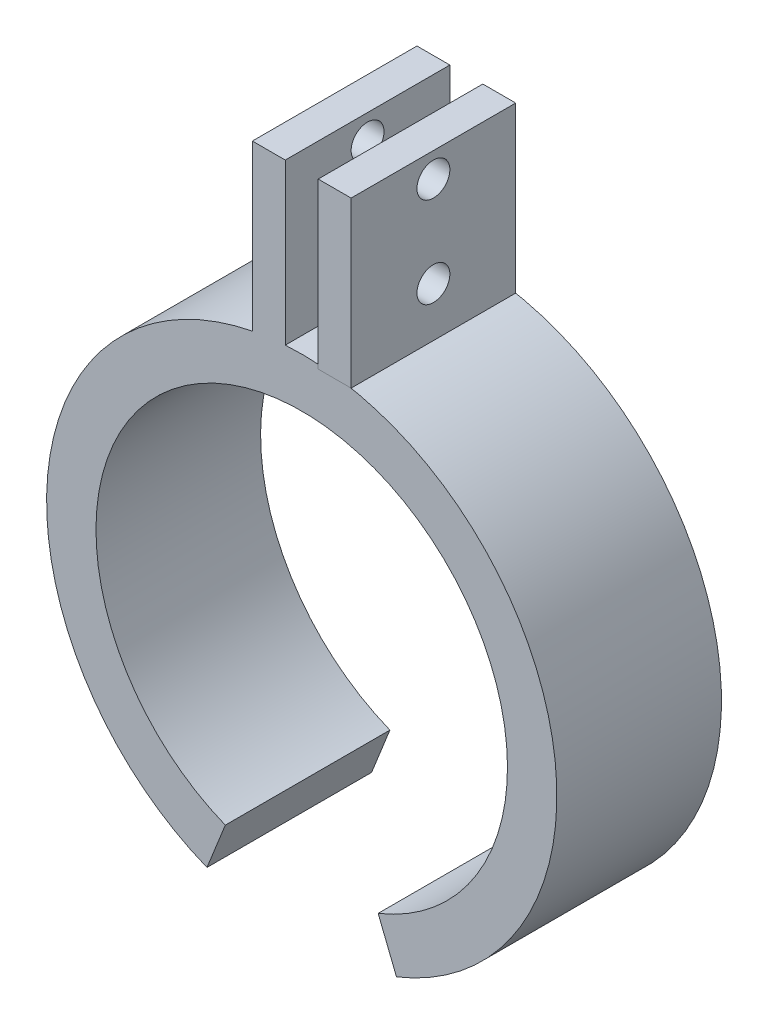
ISO-10303-21;
HEADER;
FILE_DESCRIPTION(('STEP AP214'),'2;1');
FILE_NAME('part.step','',(''),(''),'','','');
FILE_SCHEMA(('AUTOMOTIVE_DESIGN { 1 0 10303 214 1 1 1 1 }'));
ENDSEC;
DATA;
#1=APPLICATION_CONTEXT('core data for automotive mechanical design processes');
#2=APPLICATION_PROTOCOL_DEFINITION('international standard','automotive_design',2000,#1);
#3=PRODUCT_CONTEXT('',#1,'mechanical');
#4=PRODUCT('Part','Part','',(#3));
#5=PRODUCT_RELATED_PRODUCT_CATEGORY('part','',(#4));
#6=PRODUCT_DEFINITION_FORMATION('','',#4);
#7=PRODUCT_DEFINITION_CONTEXT('part definition',#1,'design');
#8=PRODUCT_DEFINITION('design','',#6,#7);
#9=PRODUCT_DEFINITION_SHAPE('','',#8);
#10=(LENGTH_UNIT() NAMED_UNIT(*) SI_UNIT(.MILLI.,.METRE.));
#11=(NAMED_UNIT(*) PLANE_ANGLE_UNIT() SI_UNIT($,.RADIAN.));
#12=(NAMED_UNIT(*) SI_UNIT($,.STERADIAN.) SOLID_ANGLE_UNIT());
#13=UNCERTAINTY_MEASURE_WITH_UNIT(LENGTH_MEASURE(1.E-05),#10,'distance_accuracy_value','');
#14=(GEOMETRIC_REPRESENTATION_CONTEXT(3) GLOBAL_UNCERTAINTY_ASSIGNED_CONTEXT((#13)) GLOBAL_UNIT_ASSIGNED_CONTEXT((#10,
#11,#12)) REPRESENTATION_CONTEXT('',''));
#15=CARTESIAN_POINT('',(0.,0.,0.));
#16=DIRECTION('',(0.,0.,1.));
#17=DIRECTION('',(1.,0.,0.));
#18=AXIS2_PLACEMENT_3D('',#15,#16,#17);
#19=CARTESIAN_POINT('',(3.,15.2069063257455,10.));
#20=DIRECTION('',(-1.,0.,0.));
#21=DIRECTION('',(0.,0.,1.));
#22=AXIS2_PLACEMENT_3D('',#19,#20,#21);
#23=PLANE('',#22);
#24=CARTESIAN_POINT('',(3.,23.7069063257455,5.));
#25=DIRECTION('',(-1.,0.,0.));
#26=DIRECTION('',(0.,0.,1.));
#27=AXIS2_PLACEMENT_3D('',#24,#25,#26);
#28=CIRCLE('',#27,1.);
#29=CARTESIAN_POINT('',(3.,23.7069063257455,6.));
#30=VERTEX_POINT('',#29);
#31=EDGE_CURVE('E117',#30,#30,#28,.T.);
#32=ORIENTED_EDGE('',*,*,#31,.T.);
#33=EDGE_LOOP('',(#32));
#34=FACE_BOUND('',#33,.T.);
#35=CARTESIAN_POINT('',(3.,18.2069063257455,5.));
#36=DIRECTION('',(-1.,0.,0.));
#37=DIRECTION('',(0.,0.,1.));
#38=AXIS2_PLACEMENT_3D('',#35,#36,#37);
#39=CIRCLE('',#38,1.);
#40=CARTESIAN_POINT('',(3.,18.2069063257455,6.));
#41=VERTEX_POINT('',#40);
#42=EDGE_CURVE('E127',#41,#41,#39,.T.);
#43=ORIENTED_EDGE('',*,*,#42,.T.);
#44=EDGE_LOOP('',(#43));
#45=FACE_BOUND('',#44,.T.);
#46=DIRECTION('',(0.,1.,0.));
#47=VECTOR('',#46,1.);
#48=CARTESIAN_POINT('',(3.,15.2069063257455,0.));
#49=LINE('',#48,#47);
#50=CARTESIAN_POINT('',(3.,15.2069063257455,0.));
#51=VERTEX_POINT('',#50);
#52=CARTESIAN_POINT('',(3.,25.2069063257455,0.));
#53=VERTEX_POINT('',#52);
#54=EDGE_CURVE('E115',#51,#53,#49,.T.);
#55=ORIENTED_EDGE('',*,*,#54,.T.);
#56=DIRECTION('',(0.,0.,-1.));
#57=VECTOR('',#56,1.);
#58=CARTESIAN_POINT('',(3.,25.2069063257455,10.));
#59=LINE('',#58,#57);
#60=CARTESIAN_POINT('',(3.,25.2069063257455,10.));
#61=VERTEX_POINT('',#60);
#62=EDGE_CURVE('E12',#61,#53,#59,.T.);
#63=ORIENTED_EDGE('',*,*,#62,.F.);
#64=DIRECTION('',(0.,1.,0.));
#65=VECTOR('',#64,1.);
#66=CARTESIAN_POINT('',(3.,15.2069063257455,10.));
#67=LINE('',#66,#65);
#68=CARTESIAN_POINT('',(3.,15.2069063257455,10.));
#69=VERTEX_POINT('',#68);
#70=EDGE_CURVE('E91',#69,#61,#67,.T.);
#71=ORIENTED_EDGE('',*,*,#70,.F.);
#72=DIRECTION('',(0.,0.,-1.));
#73=VECTOR('',#72,1.);
#74=CARTESIAN_POINT('',(3.,15.2069063257455,10.));
#75=LINE('',#74,#73);
#76=EDGE_CURVE('E67',#69,#51,#75,.T.);
#77=ORIENTED_EDGE('',*,*,#76,.T.);
#78=EDGE_LOOP('',(#55,#63,#71,#77));
#79=FACE_BOUND('',#78,.T.);
#80=ADVANCED_FACE('F49',(#34,#45,#79),#23,.F.);
#81=CARTESIAN_POINT('',(1.,25.2069063257455,10.));
#82=DIRECTION('',(0.,1.,0.));
#83=DIRECTION('',(0.,0.,1.));
#84=AXIS2_PLACEMENT_3D('',#81,#82,#83);
#85=PLANE('',#84);
#86=DIRECTION('',(1.,0.,0.));
#87=VECTOR('',#86,1.);
#88=CARTESIAN_POINT('',(1.,25.2069063257455,0.));
#89=LINE('',#88,#87);
#90=CARTESIAN_POINT('',(1.,25.2069063257455,0.));
#91=VERTEX_POINT('',#90);
#92=EDGE_CURVE('E100',#91,#53,#89,.T.);
#93=ORIENTED_EDGE('',*,*,#92,.F.);
#94=DIRECTION('',(0.,0.,-1.));
#95=VECTOR('',#94,1.);
#96=CARTESIAN_POINT('',(1.,25.2069063257455,10.));
#97=LINE('',#96,#95);
#98=CARTESIAN_POINT('',(1.,25.2069063257455,10.));
#99=VERTEX_POINT('',#98);
#100=EDGE_CURVE('E58',#99,#91,#97,.T.);
#101=ORIENTED_EDGE('',*,*,#100,.F.);
#102=DIRECTION('',(1.,0.,0.));
#103=VECTOR('',#102,1.);
#104=CARTESIAN_POINT('',(1.,25.2069063257455,10.));
#105=LINE('',#104,#103);
#106=EDGE_CURVE('E98',#99,#61,#105,.T.);
#107=ORIENTED_EDGE('',*,*,#106,.T.);
#108=ORIENTED_EDGE('',*,*,#62,.T.);
#109=EDGE_LOOP('',(#93,#101,#107,#108));
#110=FACE_BOUND('',#109,.T.);
#111=ADVANCED_FACE('F97',(#110),#85,.T.);
#112=CARTESIAN_POINT('',(1.,15.2069063257455,10.));
#113=DIRECTION('',(-1.,0.,0.));
#114=DIRECTION('',(0.,0.,1.));
#115=AXIS2_PLACEMENT_3D('',#112,#113,#114);
#116=PLANE('',#115);
#117=CARTESIAN_POINT('',(1.,23.7069063257455,5.));
#118=DIRECTION('',(-1.,0.,0.));
#119=DIRECTION('',(0.,0.,1.));
#120=AXIS2_PLACEMENT_3D('',#117,#118,#119);
#121=CIRCLE('',#120,1.);
#122=CARTESIAN_POINT('',(1.,23.7069063257455,6.));
#123=VERTEX_POINT('',#122);
#124=EDGE_CURVE('E52',#123,#123,#121,.T.);
#125=ORIENTED_EDGE('',*,*,#124,.F.);
#126=EDGE_LOOP('',(#125));
#127=FACE_BOUND('',#126,.T.);
#128=CARTESIAN_POINT('',(1.,18.2069063257455,5.));
#129=DIRECTION('',(-1.,0.,0.));
#130=DIRECTION('',(0.,0.,1.));
#131=AXIS2_PLACEMENT_3D('',#128,#129,#130);
#132=CIRCLE('',#131,1.);
#133=CARTESIAN_POINT('',(1.,18.2069063257455,6.));
#134=VERTEX_POINT('',#133);
#135=EDGE_CURVE('E125',#134,#134,#132,.T.);
#136=ORIENTED_EDGE('',*,*,#135,.F.);
#137=EDGE_LOOP('',(#136));
#138=FACE_BOUND('',#137,.T.);
#139=DIRECTION('',(0.,1.,0.));
#140=VECTOR('',#139,1.);
#141=CARTESIAN_POINT('',(1.,15.2069063257455,0.));
#142=LINE('',#141,#140);
#143=CARTESIAN_POINT('',(1.,15.2069063257455,0.));
#144=VERTEX_POINT('',#143);
#145=EDGE_CURVE('E119',#144,#91,#142,.T.);
#146=ORIENTED_EDGE('',*,*,#145,.F.);
#147=DIRECTION('',(0.,0.,-1.));
#148=VECTOR('',#147,1.);
#149=CARTESIAN_POINT('',(1.,15.2069063257455,10.));
#150=LINE('',#149,#148);
#151=CARTESIAN_POINT('',(1.,15.2069063257455,10.));
#152=VERTEX_POINT('',#151);
#153=EDGE_CURVE('E80',#152,#144,#150,.T.);
#154=ORIENTED_EDGE('',*,*,#153,.F.);
#155=DIRECTION('',(0.,1.,0.));
#156=VECTOR('',#155,1.);
#157=CARTESIAN_POINT('',(1.,15.2069063257455,10.));
#158=LINE('',#157,#156);
#159=EDGE_CURVE('E107',#152,#99,#158,.T.);
#160=ORIENTED_EDGE('',*,*,#159,.T.);
#161=ORIENTED_EDGE('',*,*,#100,.T.);
#162=EDGE_LOOP('',(#146,#154,#160,#161));
#163=FACE_BOUND('',#162,.T.);
#164=ADVANCED_FACE('F109',(#127,#138,#163),#116,.T.);
#165=CARTESIAN_POINT('',(3.,15.2069063257455,10.));
#166=DIRECTION('',(0.,-1.,0.));
#167=DIRECTION('',(0.,0.,-1.));
#168=AXIS2_PLACEMENT_3D('',#165,#166,#167);
#169=PLANE('',#168);
#170=DIRECTION('',(-1.,0.,0.));
#171=VECTOR('',#170,1.);
#172=CARTESIAN_POINT('',(3.,15.2069063257455,0.));
#173=LINE('',#172,#171);
#174=EDGE_CURVE('E121',#51,#144,#173,.T.);
#175=ORIENTED_EDGE('',*,*,#174,.F.);
#176=ORIENTED_EDGE('',*,*,#76,.F.);
#177=DIRECTION('',(-1.,0.,0.));
#178=VECTOR('',#177,1.);
#179=CARTESIAN_POINT('',(3.,15.2069063257455,10.));
#180=LINE('',#179,#178);
#181=EDGE_CURVE('E110',#69,#152,#180,.T.);
#182=ORIENTED_EDGE('',*,*,#181,.T.);
#183=ORIENTED_EDGE('',*,*,#153,.T.);
#184=EDGE_LOOP('',(#175,#176,#182,#183));
#185=FACE_BOUND('',#184,.T.);
#186=ADVANCED_FACE('F157',(#185),#169,.T.);
#187=CARTESIAN_POINT('',(0.,0.,10.));
#188=DIRECTION('',(0.,0.,-1.));
#189=DIRECTION('',(-1.,0.,0.));
#190=AXIS2_PLACEMENT_3D('',#187,#188,#189);
#191=PLANE('',#190);
#192=ORIENTED_EDGE('',*,*,#70,.T.);
#193=ORIENTED_EDGE('',*,*,#106,.F.);
#194=ORIENTED_EDGE('',*,*,#159,.F.);
#195=ORIENTED_EDGE('',*,*,#181,.F.);
#196=EDGE_LOOP('',(#192,#193,#194,#195));
#197=FACE_BOUND('',#196,.T.);
#198=ADVANCED_FACE('F106',(#197),#191,.F.);
#199=CARTESIAN_POINT('',(0.,0.,0.));
#200=DIRECTION('',(0.,0.,-1.));
#201=DIRECTION('',(-1.,0.,0.));
#202=AXIS2_PLACEMENT_3D('',#199,#200,#201);
#203=PLANE('',#202);
#204=ORIENTED_EDGE('',*,*,#54,.F.);
#205=ORIENTED_EDGE('',*,*,#174,.T.);
#206=ORIENTED_EDGE('',*,*,#145,.T.);
#207=ORIENTED_EDGE('',*,*,#92,.T.);
#208=EDGE_LOOP('',(#204,#205,#206,#207));
#209=FACE_BOUND('',#208,.T.);
#210=ADVANCED_FACE('F148',(#209),#203,.T.);
#211=CARTESIAN_POINT('',(15.5,18.2069063257455,5.));
#212=DIRECTION('',(-1.,0.,0.));
#213=DIRECTION('',(0.,0.,1.));
#214=AXIS2_PLACEMENT_3D('',#211,#212,#213);
#215=CYLINDRICAL_SURFACE('',#214,1.);
#216=ORIENTED_EDGE('',*,*,#135,.T.);
#217=EDGE_LOOP('',(#216));
#218=FACE_BOUND('',#217,.T.);
#219=ORIENTED_EDGE('',*,*,#42,.F.);
#220=EDGE_LOOP('',(#219));
#221=FACE_BOUND('',#220,.T.);
#222=ADVANCED_FACE('F142',(#218,#221),#215,.F.);
#223=CARTESIAN_POINT('',(15.5,23.7069063257455,5.));
#224=DIRECTION('',(-1.,0.,0.));
#225=DIRECTION('',(0.,0.,1.));
#226=AXIS2_PLACEMENT_3D('',#223,#224,#225);
#227=CYLINDRICAL_SURFACE('',#226,1.);
#228=ORIENTED_EDGE('',*,*,#124,.T.);
#229=EDGE_LOOP('',(#228));
#230=FACE_BOUND('',#229,.T.);
#231=ORIENTED_EDGE('',*,*,#31,.F.);
#232=EDGE_LOOP('',(#231));
#233=FACE_BOUND('',#232,.T.);
#234=ADVANCED_FACE('F140',(#230,#233),#227,.F.);
#235=CLOSED_SHELL('',(#80,#111,#164,#186,#198,#210,#222,#234));
#236=MANIFOLD_SOLID_BREP('B2',#235);
#237=CARTESIAN_POINT('',(0.,0.,10.));
#238=DIRECTION('',(0.,0.,-1.));
#239=DIRECTION('',(-1.,0.,0.));
#240=AXIS2_PLACEMENT_3D('',#237,#238,#239);
#241=CYLINDRICAL_SURFACE('',#240,15.5);
#242=DIRECTION('',(0.,0.,1.));
#243=VECTOR('',#242,1.);
#244=CARTESIAN_POINT('',(-3.,15.2069063257455,0.));
#245=LINE('',#244,#243);
#246=CARTESIAN_POINT('',(-3.,15.2069063257455,0.));
#247=VERTEX_POINT('',#246);
#248=CARTESIAN_POINT('',(-3.,15.2069063257455,10.));
#249=VERTEX_POINT('',#248);
#250=EDGE_CURVE('E319',#247,#249,#245,.T.);
#251=ORIENTED_EDGE('',*,*,#250,.F.);
#252=CARTESIAN_POINT('',(0.,0.,0.));
#253=DIRECTION('',(0.,0.,1.));
#254=DIRECTION('',(1.,0.,0.));
#255=AXIS2_PLACEMENT_3D('',#252,#253,#254);
#256=CIRCLE('',#255,15.5);
#257=CARTESIAN_POINT('',(-5.75655548348861,-14.3913887087215,0.));
#258=VERTEX_POINT('',#257);
#259=EDGE_CURVE('E326',#247,#258,#256,.T.);
#260=ORIENTED_EDGE('',*,*,#259,.T.);
#261=DIRECTION('',(0.,0.,-1.));
#262=VECTOR('',#261,1.);
#263=CARTESIAN_POINT('',(-5.75655548348861,-14.3913887087215,10.));
#264=LINE('',#263,#262);
#265=CARTESIAN_POINT('',(-5.75655548348861,-14.3913887087215,10.));
#266=VERTEX_POINT('',#265);
#267=EDGE_CURVE('E47',#266,#258,#264,.T.);
#268=ORIENTED_EDGE('',*,*,#267,.F.);
#269=CARTESIAN_POINT('',(0.,0.,10.));
#270=DIRECTION('',(0.,0.,1.));
#271=DIRECTION('',(1.,0.,0.));
#272=AXIS2_PLACEMENT_3D('',#269,#270,#271);
#273=CIRCLE('',#272,15.5);
#274=EDGE_CURVE('E266',#249,#266,#273,.T.);
#275=ORIENTED_EDGE('',*,*,#274,.F.);
#276=EDGE_LOOP('',(#251,#260,#268,#275));
#277=FACE_BOUND('',#276,.T.);
#278=ADVANCED_FACE('F215',(#277),#241,.T.);
#279=CARTESIAN_POINT('',(5.75655548348861,-14.3913887087215,0.));
#280=VERTEX_POINT('',#279);
#281=CARTESIAN_POINT('',(-1.,15.467708298258,0.));
#282=VERTEX_POINT('',#281);
#283=EDGE_CURVE('E342',#280,#282,#256,.T.);
#284=ORIENTED_EDGE('',*,*,#283,.T.);
#285=DIRECTION('',(0.,0.,-1.));
#286=VECTOR('',#285,1.);
#287=CARTESIAN_POINT('',(-1.,15.467708298258,10.));
#288=LINE('',#287,#286);
#289=CARTESIAN_POINT('',(-1.,15.467708298258,10.));
#290=VERTEX_POINT('',#289);
#291=EDGE_CURVE('E298',#282,#290,#288,.F.);
#292=ORIENTED_EDGE('',*,*,#291,.T.);
#293=CARTESIAN_POINT('',(5.75655548348861,-14.3913887087215,10.));
#294=VERTEX_POINT('',#293);
#295=EDGE_CURVE('E327',#294,#290,#273,.T.);
#296=ORIENTED_EDGE('',*,*,#295,.F.);
#297=DIRECTION('',(0.,0.,-1.));
#298=VECTOR('',#297,1.);
#299=CARTESIAN_POINT('',(5.75655548348861,-14.3913887087215,10.));
#300=LINE('',#299,#298);
#301=EDGE_CURVE('E242',#294,#280,#300,.T.);
#302=ORIENTED_EDGE('',*,*,#301,.T.);
#303=EDGE_LOOP('',(#284,#292,#296,#302));
#304=FACE_BOUND('',#303,.T.);
#305=ADVANCED_FACE('F217',(#304),#241,.T.);
#306=CARTESIAN_POINT('',(-4.6423834544263,-11.6059586360657,10.));
#307=DIRECTION('',(0.928476690885259,-0.371390676354104,0.));
#308=DIRECTION('',(0.371390676354104,0.928476690885259,0.));
#309=AXIS2_PLACEMENT_3D('',#306,#307,#308);
#310=PLANE('',#309);
#311=DIRECTION('',(-0.371390676354104,-0.928476690885259,0.));
#312=VECTOR('',#311,1.);
#313=CARTESIAN_POINT('',(-4.6423834544263,-11.6059586360657,0.));
#314=LINE('',#313,#312);
#315=CARTESIAN_POINT('',(-4.6423834544263,-11.6059586360657,0.));
#316=VERTEX_POINT('',#315);
#317=EDGE_CURVE('E345',#316,#258,#314,.T.);
#318=ORIENTED_EDGE('',*,*,#317,.F.);
#319=DIRECTION('',(0.,0.,-1.));
#320=VECTOR('',#319,1.);
#321=CARTESIAN_POINT('',(-4.6423834544263,-11.6059586360657,10.));
#322=LINE('',#321,#320);
#323=CARTESIAN_POINT('',(-4.6423834544263,-11.6059586360657,10.));
#324=VERTEX_POINT('',#323);
#325=EDGE_CURVE('E225',#324,#316,#322,.T.);
#326=ORIENTED_EDGE('',*,*,#325,.F.);
#327=DIRECTION('',(-0.371390676354104,-0.928476690885259,0.));
#328=VECTOR('',#327,1.);
#329=CARTESIAN_POINT('',(-4.6423834544263,-11.6059586360657,10.));
#330=LINE('',#329,#328);
#331=EDGE_CURVE('E331',#324,#266,#330,.T.);
#332=ORIENTED_EDGE('',*,*,#331,.T.);
#333=ORIENTED_EDGE('',*,*,#267,.T.);
#334=EDGE_LOOP('',(#318,#326,#332,#333));
#335=FACE_BOUND('',#334,.T.);
#336=ADVANCED_FACE('F396',(#335),#310,.T.);
#337=CARTESIAN_POINT('',(0.,0.,10.));
#338=DIRECTION('',(0.,0.,-1.));
#339=DIRECTION('',(-1.,0.,0.));
#340=AXIS2_PLACEMENT_3D('',#337,#338,#339);
#341=CYLINDRICAL_SURFACE('',#340,12.5);
#342=CARTESIAN_POINT('',(0.,0.,0.));
#343=DIRECTION('',(0.,0.,1.));
#344=DIRECTION('',(1.,0.,0.));
#345=AXIS2_PLACEMENT_3D('',#342,#343,#344);
#346=CIRCLE('',#345,12.5);
#347=CARTESIAN_POINT('',(4.64238345442629,-11.6059586360657,0.));
#348=VERTEX_POINT('',#347);
#349=EDGE_CURVE('E349',#348,#316,#346,.T.);
#350=ORIENTED_EDGE('',*,*,#349,.F.);
#351=DIRECTION('',(0.,0.,-1.));
#352=VECTOR('',#351,1.);
#353=CARTESIAN_POINT('',(4.64238345442629,-11.6059586360657,10.));
#354=LINE('',#353,#352);
#355=CARTESIAN_POINT('',(4.64238345442629,-11.6059586360657,10.));
#356=VERTEX_POINT('',#355);
#357=EDGE_CURVE('E359',#356,#348,#354,.T.);
#358=ORIENTED_EDGE('',*,*,#357,.F.);
#359=CARTESIAN_POINT('',(0.,0.,10.));
#360=DIRECTION('',(0.,0.,1.));
#361=DIRECTION('',(1.,0.,0.));
#362=AXIS2_PLACEMENT_3D('',#359,#360,#361);
#363=CIRCLE('',#362,12.5);
#364=EDGE_CURVE('E335',#356,#324,#363,.T.);
#365=ORIENTED_EDGE('',*,*,#364,.T.);
#366=ORIENTED_EDGE('',*,*,#325,.T.);
#367=EDGE_LOOP('',(#350,#358,#365,#366));
#368=FACE_BOUND('',#367,.T.);
#369=ADVANCED_FACE('F399',(#368),#341,.F.);
#370=CARTESIAN_POINT('',(5.75655548348861,-14.3913887087215,10.));
#371=DIRECTION('',(-0.928476690885259,-0.371390676354103,0.));
#372=DIRECTION('',(0.371390676354103,-0.928476690885259,0.));
#373=AXIS2_PLACEMENT_3D('',#370,#371,#372);
#374=PLANE('',#373);
#375=DIRECTION('',(-0.371390676354103,0.928476690885259,0.));
#376=VECTOR('',#375,1.);
#377=CARTESIAN_POINT('',(5.75655548348861,-14.3913887087215,0.));
#378=LINE('',#377,#376);
#379=EDGE_CURVE('E353',#280,#348,#378,.T.);
#380=ORIENTED_EDGE('',*,*,#379,.F.);
#381=ORIENTED_EDGE('',*,*,#301,.F.);
#382=DIRECTION('',(-0.371390676354103,0.928476690885259,0.));
#383=VECTOR('',#382,1.);
#384=CARTESIAN_POINT('',(5.75655548348861,-14.3913887087215,10.));
#385=LINE('',#384,#383);
#386=EDGE_CURVE('E339',#294,#356,#385,.T.);
#387=ORIENTED_EDGE('',*,*,#386,.T.);
#388=ORIENTED_EDGE('',*,*,#357,.T.);
#389=EDGE_LOOP('',(#380,#381,#387,#388));
#390=FACE_BOUND('',#389,.T.);
#391=ADVANCED_FACE('F403',(#390),#374,.T.);
#392=CARTESIAN_POINT('',(0.,0.,10.));
#393=DIRECTION('',(0.,0.,1.));
#394=DIRECTION('',(1.,0.,0.));
#395=AXIS2_PLACEMENT_3D('',#392,#393,#394);
#396=PLANE('',#395);
#397=ORIENTED_EDGE('',*,*,#295,.T.);
#398=DIRECTION('',(0.,1.,0.));
#399=VECTOR('',#398,1.);
#400=CARTESIAN_POINT('',(-1.,15.2069063257455,10.));
#401=LINE('',#400,#399);
#402=CARTESIAN_POINT('',(-1.,25.2069063257455,10.));
#403=VERTEX_POINT('',#402);
#404=EDGE_CURVE('E380',#290,#403,#401,.T.);
#405=ORIENTED_EDGE('',*,*,#404,.T.);
#406=DIRECTION('',(1.,0.,0.));
#407=VECTOR('',#406,1.);
#408=CARTESIAN_POINT('',(-3.,25.2069063257455,10.));
#409=LINE('',#408,#407);
#410=CARTESIAN_POINT('',(-3.,25.2069063257455,10.));
#411=VERTEX_POINT('',#410);
#412=EDGE_CURVE('E313',#411,#403,#409,.T.);
#413=ORIENTED_EDGE('',*,*,#412,.F.);
#414=DIRECTION('',(0.,1.,0.));
#415=VECTOR('',#414,1.);
#416=CARTESIAN_POINT('',(-3.,15.2069063257455,10.));
#417=LINE('',#416,#415);
#418=EDGE_CURVE('E233',#249,#411,#417,.T.);
#419=ORIENTED_EDGE('',*,*,#418,.F.);
#420=ORIENTED_EDGE('',*,*,#274,.T.);
#421=ORIENTED_EDGE('',*,*,#331,.F.);
#422=ORIENTED_EDGE('',*,*,#364,.F.);
#423=ORIENTED_EDGE('',*,*,#386,.F.);
#424=EDGE_LOOP('',(#397,#405,#413,#419,#420,#421,#422,#423));
#425=FACE_BOUND('',#424,.T.);
#426=ADVANCED_FACE('F401',(#425),#396,.T.);
#427=CARTESIAN_POINT('',(0.,0.,0.));
#428=DIRECTION('',(0.,0.,1.));
#429=DIRECTION('',(1.,0.,0.));
#430=AXIS2_PLACEMENT_3D('',#427,#428,#429);
#431=PLANE('',#430);
#432=ORIENTED_EDGE('',*,*,#259,.F.);
#433=DIRECTION('',(0.,1.,0.));
#434=VECTOR('',#433,1.);
#435=CARTESIAN_POINT('',(-3.,15.2069063257455,0.));
#436=LINE('',#435,#434);
#437=CARTESIAN_POINT('',(-3.,25.2069063257455,0.));
#438=VERTEX_POINT('',#437);
#439=EDGE_CURVE('E306',#247,#438,#436,.T.);
#440=ORIENTED_EDGE('',*,*,#439,.T.);
#441=DIRECTION('',(1.,0.,0.));
#442=VECTOR('',#441,1.);
#443=CARTESIAN_POINT('',(-3.,25.2069063257455,0.));
#444=LINE('',#443,#442);
#445=CARTESIAN_POINT('',(-1.,25.2069063257455,0.));
#446=VERTEX_POINT('',#445);
#447=EDGE_CURVE('E301',#438,#446,#444,.T.);
#448=ORIENTED_EDGE('',*,*,#447,.T.);
#449=DIRECTION('',(0.,1.,0.));
#450=VECTOR('',#449,1.);
#451=CARTESIAN_POINT('',(-1.,15.2069063257455,0.));
#452=LINE('',#451,#450);
#453=EDGE_CURVE('E291',#282,#446,#452,.T.);
#454=ORIENTED_EDGE('',*,*,#453,.F.);
#455=ORIENTED_EDGE('',*,*,#283,.F.);
#456=ORIENTED_EDGE('',*,*,#379,.T.);
#457=ORIENTED_EDGE('',*,*,#349,.T.);
#458=ORIENTED_EDGE('',*,*,#317,.T.);
#459=EDGE_LOOP('',(#432,#440,#448,#454,#455,#456,#457,#458));
#460=FACE_BOUND('',#459,.T.);
#461=ADVANCED_FACE('F305',(#460),#431,.F.);
#462=CARTESIAN_POINT('',(-1.,15.2069063257455,0.));
#463=DIRECTION('',(1.,0.,0.));
#464=DIRECTION('',(0.,0.,-1.));
#465=AXIS2_PLACEMENT_3D('',#462,#463,#464);
#466=PLANE('',#465);
#467=CARTESIAN_POINT('',(-1.,23.7069063257455,5.));
#468=DIRECTION('',(1.,0.,0.));
#469=DIRECTION('',(0.,0.,-1.));
#470=AXIS2_PLACEMENT_3D('',#467,#468,#469);
#471=CIRCLE('',#470,1.);
#472=CARTESIAN_POINT('',(-1.,23.7069063257455,4.));
#473=VERTEX_POINT('',#472);
#474=EDGE_CURVE('E376',#473,#473,#471,.T.);
#475=ORIENTED_EDGE('',*,*,#474,.F.);
#476=EDGE_LOOP('',(#475));
#477=FACE_BOUND('',#476,.T.);
#478=CARTESIAN_POINT('',(-1.,18.2069063257455,5.));
#479=DIRECTION('',(1.,0.,0.));
#480=DIRECTION('',(0.,0.,-1.));
#481=AXIS2_PLACEMENT_3D('',#478,#479,#480);
#482=CIRCLE('',#481,1.);
#483=CARTESIAN_POINT('',(-1.,18.2069063257455,4.));
#484=VERTEX_POINT('',#483);
#485=EDGE_CURVE('E366',#484,#484,#482,.T.);
#486=ORIENTED_EDGE('',*,*,#485,.F.);
#487=EDGE_LOOP('',(#486));
#488=FACE_BOUND('',#487,.T.);
#489=ORIENTED_EDGE('',*,*,#291,.F.);
#490=ORIENTED_EDGE('',*,*,#453,.T.);
#491=DIRECTION('',(0.,0.,1.));
#492=VECTOR('',#491,1.);
#493=CARTESIAN_POINT('',(-1.,25.2069063257455,0.));
#494=LINE('',#493,#492);
#495=EDGE_CURVE('E295',#446,#403,#494,.T.);
#496=ORIENTED_EDGE('',*,*,#495,.T.);
#497=ORIENTED_EDGE('',*,*,#404,.F.);
#498=EDGE_LOOP('',(#489,#490,#496,#497));
#499=FACE_BOUND('',#498,.T.);
#500=ADVANCED_FACE('F293',(#477,#488,#499),#466,.T.);
#501=CARTESIAN_POINT('',(-3.,15.2069063257455,0.));
#502=DIRECTION('',(1.,0.,0.));
#503=DIRECTION('',(0.,0.,-1.));
#504=AXIS2_PLACEMENT_3D('',#501,#502,#503);
#505=PLANE('',#504);
#506=CARTESIAN_POINT('',(-3.,23.7069063257455,5.));
#507=DIRECTION('',(1.,0.,0.));
#508=DIRECTION('',(0.,0.,-1.));
#509=AXIS2_PLACEMENT_3D('',#506,#507,#508);
#510=CIRCLE('',#509,1.);
#511=CARTESIAN_POINT('',(-3.,23.7069063257455,4.));
#512=VERTEX_POINT('',#511);
#513=EDGE_CURVE('E219',#512,#512,#510,.T.);
#514=ORIENTED_EDGE('',*,*,#513,.T.);
#515=EDGE_LOOP('',(#514));
#516=FACE_BOUND('',#515,.T.);
#517=CARTESIAN_POINT('',(-3.,18.2069063257455,5.));
#518=DIRECTION('',(1.,0.,0.));
#519=DIRECTION('',(0.,0.,-1.));
#520=AXIS2_PLACEMENT_3D('',#517,#518,#519);
#521=CIRCLE('',#520,1.);
#522=CARTESIAN_POINT('',(-3.,18.2069063257455,4.));
#523=VERTEX_POINT('',#522);
#524=EDGE_CURVE('E363',#523,#523,#521,.T.);
#525=ORIENTED_EDGE('',*,*,#524,.T.);
#526=EDGE_LOOP('',(#525));
#527=FACE_BOUND('',#526,.T.);
#528=ORIENTED_EDGE('',*,*,#418,.T.);
#529=DIRECTION('',(0.,0.,1.));
#530=VECTOR('',#529,1.);
#531=CARTESIAN_POINT('',(-3.,25.2069063257455,0.));
#532=LINE('',#531,#530);
#533=EDGE_CURVE('E315',#438,#411,#532,.T.);
#534=ORIENTED_EDGE('',*,*,#533,.F.);
#535=ORIENTED_EDGE('',*,*,#439,.F.);
#536=ORIENTED_EDGE('',*,*,#250,.T.);
#537=EDGE_LOOP('',(#528,#534,#535,#536));
#538=FACE_BOUND('',#537,.T.);
#539=ADVANCED_FACE('F390',(#516,#527,#538),#505,.F.);
#540=CARTESIAN_POINT('',(-3.,25.2069063257455,0.));
#541=DIRECTION('',(0.,-1.,0.));
#542=DIRECTION('',(0.,0.,-1.));
#543=AXIS2_PLACEMENT_3D('',#540,#541,#542);
#544=PLANE('',#543);
#545=ORIENTED_EDGE('',*,*,#412,.T.);
#546=ORIENTED_EDGE('',*,*,#495,.F.);
#547=ORIENTED_EDGE('',*,*,#447,.F.);
#548=ORIENTED_EDGE('',*,*,#533,.T.);
#549=EDGE_LOOP('',(#545,#546,#547,#548));
#550=FACE_BOUND('',#549,.T.);
#551=ADVANCED_FACE('F312',(#550),#544,.F.);
#552=CARTESIAN_POINT('',(15.5,18.2069063257455,5.));
#553=DIRECTION('',(-1.,0.,0.));
#554=DIRECTION('',(0.,0.,1.));
#555=AXIS2_PLACEMENT_3D('',#552,#553,#554);
#556=CYLINDRICAL_SURFACE('',#555,1.);
#557=ORIENTED_EDGE('',*,*,#485,.T.);
#558=EDGE_LOOP('',(#557));
#559=FACE_BOUND('',#558,.T.);
#560=ORIENTED_EDGE('',*,*,#524,.F.);
#561=EDGE_LOOP('',(#560));
#562=FACE_BOUND('',#561,.T.);
#563=ADVANCED_FACE('F464',(#559,#562),#556,.F.);
#564=CARTESIAN_POINT('',(15.5,23.7069063257455,5.));
#565=DIRECTION('',(-1.,0.,0.));
#566=DIRECTION('',(0.,0.,1.));
#567=AXIS2_PLACEMENT_3D('',#564,#565,#566);
#568=CYLINDRICAL_SURFACE('',#567,1.);
#569=ORIENTED_EDGE('',*,*,#474,.T.);
#570=EDGE_LOOP('',(#569));
#571=FACE_BOUND('',#570,.T.);
#572=ORIENTED_EDGE('',*,*,#513,.F.);
#573=EDGE_LOOP('',(#572));
#574=FACE_BOUND('',#573,.T.);
#575=ADVANCED_FACE('F489',(#571,#574),#568,.F.);
#576=CLOSED_SHELL('',(#278,#305,#336,#369,#391,#426,#461,#500,#539,#551,#563,#575));
#577=MANIFOLD_SOLID_BREP('B6',#576);
#578=ADVANCED_BREP_SHAPE_REPRESENTATION('',(#18,#236,#577),#14);
#579=SHAPE_DEFINITION_REPRESENTATION(#9,#578);
ENDSEC;
END-ISO-10303-21;
